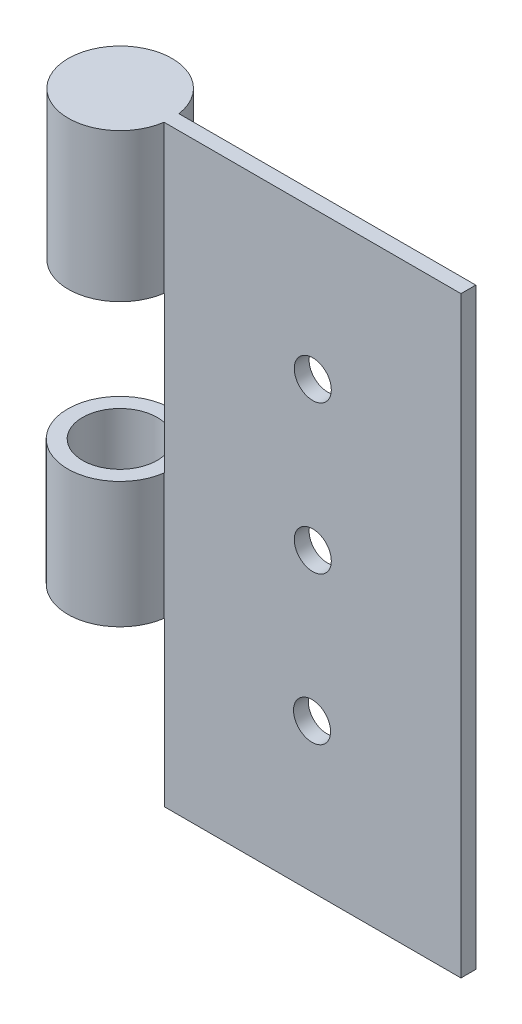
ISO-10303-21;
HEADER;
FILE_DESCRIPTION(('STEP AP214'),'2;1');
FILE_NAME('part.step','',(''),(''),'','','');
FILE_SCHEMA(('AUTOMOTIVE_DESIGN { 1 0 10303 214 1 1 1 1 }'));
ENDSEC;
DATA;
#1=APPLICATION_CONTEXT('core data for automotive mechanical design processes');
#2=APPLICATION_PROTOCOL_DEFINITION('international standard','automotive_design',2000,#1);
#3=PRODUCT_CONTEXT('',#1,'mechanical');
#4=PRODUCT('Part','Part','',(#3));
#5=PRODUCT_RELATED_PRODUCT_CATEGORY('part','',(#4));
#6=PRODUCT_DEFINITION_FORMATION('','',#4);
#7=PRODUCT_DEFINITION_CONTEXT('part definition',#1,'design');
#8=PRODUCT_DEFINITION('design','',#6,#7);
#9=PRODUCT_DEFINITION_SHAPE('','',#8);
#10=(LENGTH_UNIT() NAMED_UNIT(*) SI_UNIT(.MILLI.,.METRE.));
#11=(NAMED_UNIT(*) PLANE_ANGLE_UNIT() SI_UNIT($,.RADIAN.));
#12=(NAMED_UNIT(*) SI_UNIT($,.STERADIAN.) SOLID_ANGLE_UNIT());
#13=UNCERTAINTY_MEASURE_WITH_UNIT(LENGTH_MEASURE(1.E-05),#10,'distance_accuracy_value','');
#14=(GEOMETRIC_REPRESENTATION_CONTEXT(3) GLOBAL_UNCERTAINTY_ASSIGNED_CONTEXT((#13)) GLOBAL_UNIT_ASSIGNED_CONTEXT((#10,
#11,#12)) REPRESENTATION_CONTEXT('',''));
#15=CARTESIAN_POINT('',(0.,0.,0.));
#16=DIRECTION('',(0.,0.,1.));
#17=DIRECTION('',(1.,0.,0.));
#18=AXIS2_PLACEMENT_3D('',#15,#16,#17);
#19=CARTESIAN_POINT('',(-8.89,0.,-1.27));
#20=DIRECTION('',(0.,-1.,0.));
#21=DIRECTION('',(0.,0.,-1.));
#22=AXIS2_PLACEMENT_3D('',#19,#20,#21);
#23=CYLINDRICAL_SURFACE('',#22,6.35);
#24=CARTESIAN_POINT('',(-8.89,76.2,-1.27));
#25=DIRECTION('',(0.,-1.,0.));
#26=DIRECTION('',(0.,0.,-1.));
#27=AXIS2_PLACEMENT_3D('',#24,#25,#26);
#28=CIRCLE('',#27,6.35);
#29=CARTESIAN_POINT('',(-8.89,76.2,-7.62));
#30=VERTEX_POINT('',#29);
#31=EDGE_CURVE('E164',#30,#30,#28,.T.);
#32=ORIENTED_EDGE('',*,*,#31,.T.);
#33=EDGE_LOOP('',(#32));
#34=FACE_BOUND('',#33,.T.);
#35=CARTESIAN_POINT('',(-8.89,99.06,-1.27));
#36=DIRECTION('',(0.,1.,0.));
#37=DIRECTION('',(0.,0.,1.));
#38=AXIS2_PLACEMENT_3D('',#35,#36,#37);
#39=CIRCLE('',#38,6.35);
#40=CARTESIAN_POINT('',(-8.89,99.06,5.08));
#41=VERTEX_POINT('',#40);
#42=EDGE_CURVE('E138',#41,#41,#39,.T.);
#43=ORIENTED_EDGE('',*,*,#42,.T.);
#44=EDGE_LOOP('',(#43));
#45=FACE_BOUND('',#44,.T.);
#46=ADVANCED_FACE('F33',(#34,#45),#23,.F.);
#47=CARTESIAN_POINT('',(0.,0.,-2.54));
#48=DIRECTION('',(-1.,0.,0.));
#49=DIRECTION('',(0.,0.,1.));
#50=AXIS2_PLACEMENT_3D('',#47,#48,#49);
#51=PLANE('',#50);
#52=DIRECTION('',(0.,-1.,0.));
#53=VECTOR('',#52,1.);
#54=CARTESIAN_POINT('',(0.,0.,-2.54));
#55=LINE('',#54,#53);
#56=CARTESIAN_POINT('',(0.,76.2,-2.54));
#57=VERTEX_POINT('',#56);
#58=CARTESIAN_POINT('',(0.,49.53,-2.54));
#59=VERTEX_POINT('',#58);
#60=EDGE_CURVE('E197',#57,#59,#55,.T.);
#61=ORIENTED_EDGE('',*,*,#60,.T.);
#62=DIRECTION('',(0.,0.,-1.));
#63=VECTOR('',#62,1.);
#64=CARTESIAN_POINT('',(0.,49.53,-2.54));
#65=LINE('',#64,#63);
#66=CARTESIAN_POINT('',(0.,49.53,0.));
#67=VERTEX_POINT('',#66);
#68=EDGE_CURVE('E58',#67,#59,#65,.T.);
#69=ORIENTED_EDGE('',*,*,#68,.F.);
#70=DIRECTION('',(0.,-1.,0.));
#71=VECTOR('',#70,1.);
#72=CARTESIAN_POINT('',(0.,0.,0.));
#73=LINE('',#72,#71);
#74=CARTESIAN_POINT('',(0.,76.2,0.));
#75=VERTEX_POINT('',#74);
#76=EDGE_CURVE('E207',#75,#67,#73,.T.);
#77=ORIENTED_EDGE('',*,*,#76,.F.);
#78=DIRECTION('',(0.,0.,1.));
#79=VECTOR('',#78,1.);
#80=CARTESIAN_POINT('',(0.,76.2,0.));
#81=LINE('',#80,#79);
#82=EDGE_CURVE('E176',#57,#75,#81,.T.);
#83=ORIENTED_EDGE('',*,*,#82,.F.);
#84=EDGE_LOOP('',(#61,#69,#77,#83));
#85=FACE_BOUND('',#84,.T.);
#86=ADVANCED_FACE('F35',(#85),#51,.T.);
#87=DIRECTION('',(0.,0.,1.));
#88=VECTOR('',#87,1.);
#89=CARTESIAN_POINT('',(0.,27.94,-2.53999999999999));
#90=LINE('',#89,#88);
#91=CARTESIAN_POINT('',(0.,27.94,-2.54));
#92=VERTEX_POINT('',#91);
#93=CARTESIAN_POINT('',(0.,27.94,0.));
#94=VERTEX_POINT('',#93);
#95=EDGE_CURVE('E50',#92,#94,#90,.T.);
#96=ORIENTED_EDGE('',*,*,#95,.F.);
#97=CARTESIAN_POINT('',(0.,0.,-2.54));
#98=VERTEX_POINT('',#97);
#99=EDGE_CURVE('E135',#92,#98,#55,.T.);
#100=ORIENTED_EDGE('',*,*,#99,.T.);
#101=DIRECTION('',(0.,0.,1.));
#102=VECTOR('',#101,1.);
#103=CARTESIAN_POINT('',(0.,0.,-2.54));
#104=LINE('',#103,#102);
#105=CARTESIAN_POINT('',(0.,0.,0.));
#106=VERTEX_POINT('',#105);
#107=EDGE_CURVE('E37',#98,#106,#104,.T.);
#108=ORIENTED_EDGE('',*,*,#107,.T.);
#109=EDGE_CURVE('E196',#94,#106,#73,.T.);
#110=ORIENTED_EDGE('',*,*,#109,.F.);
#111=EDGE_LOOP('',(#96,#100,#108,#110));
#112=FACE_BOUND('',#111,.T.);
#113=ADVANCED_FACE('F222',(#112),#51,.T.);
#114=CARTESIAN_POINT('',(-8.93559094884371,101.6,-1.27));
#115=DIRECTION('',(0.,1.,0.));
#116=DIRECTION('',(-1.,0.,0.));
#117=AXIS2_PLACEMENT_3D('',#114,#115,#116);
#118=CYLINDRICAL_SURFACE('',#117,8.9355909488437);
#119=CARTESIAN_POINT('',(-8.9355909488437,49.53,-1.27));
#120=DIRECTION('',(0.,1.,0.));
#121=DIRECTION('',(-1.,0.,0.));
#122=AXIS2_PLACEMENT_3D('',#119,#120,#121);
#123=CIRCLE('',#122,8.9355909488437);
#124=CARTESIAN_POINT('',(-0.090711887767882,49.53,-2.54));
#125=VERTEX_POINT('',#124);
#126=CARTESIAN_POINT('',(-0.090711887767882,49.53,0.));
#127=VERTEX_POINT('',#126);
#128=EDGE_CURVE('E123',#125,#127,#123,.T.);
#129=ORIENTED_EDGE('',*,*,#128,.F.);
#130=DIRECTION('',(0.,1.,0.));
#131=VECTOR('',#130,1.);
#132=CARTESIAN_POINT('',(-0.0907118877678907,101.6,-2.54));
#133=LINE('',#132,#131);
#134=CARTESIAN_POINT('',(-0.0907118877678803,27.94,-2.53999999999999));
#135=VERTEX_POINT('',#134);
#136=EDGE_CURVE('E127',#135,#125,#133,.T.);
#137=ORIENTED_EDGE('',*,*,#136,.F.);
#138=CARTESIAN_POINT('',(-8.9355909488437,27.94,-1.27));
#139=DIRECTION('',(0.,1.,0.));
#140=DIRECTION('',(-1.,0.,0.));
#141=AXIS2_PLACEMENT_3D('',#138,#139,#140);
#142=CIRCLE('',#141,8.9355909488437);
#143=CARTESIAN_POINT('',(-0.090711887767882,27.94,0.));
#144=VERTEX_POINT('',#143);
#145=EDGE_CURVE('E112',#135,#144,#142,.T.);
#146=ORIENTED_EDGE('',*,*,#145,.T.);
#147=DIRECTION('',(0.,1.,0.));
#148=VECTOR('',#147,1.);
#149=CARTESIAN_POINT('',(-0.090711887767889,101.6,0.));
#150=LINE('',#149,#148);
#151=EDGE_CURVE('E148',#127,#144,#150,.F.);
#152=ORIENTED_EDGE('',*,*,#151,.F.);
#153=EDGE_LOOP('',(#129,#137,#146,#152));
#154=FACE_BOUND('',#153,.T.);
#155=ADVANCED_FACE('F128',(#154),#118,.T.);
#156=CARTESIAN_POINT('',(-8.89,0.,-1.27));
#157=DIRECTION('',(0.,-1.,0.));
#158=DIRECTION('',(0.,0.,-1.));
#159=AXIS2_PLACEMENT_3D('',#156,#157,#158);
#160=CYLINDRICAL_SURFACE('',#159,8.89);
#161=CARTESIAN_POINT('',(-8.89,101.6,-1.27));
#162=DIRECTION('',(0.,-1.,0.));
#163=DIRECTION('',(0.,0.,-1.));
#164=AXIS2_PLACEMENT_3D('',#161,#162,#163);
#165=CIRCLE('',#164,8.89);
#166=CARTESIAN_POINT('',(-0.0911818976874201,101.6,0.));
#167=VERTEX_POINT('',#166);
#168=CARTESIAN_POINT('',(-0.0911818975501029,101.6,-2.54));
#169=VERTEX_POINT('',#168);
#170=EDGE_CURVE('E167',#167,#169,#165,.T.);
#171=ORIENTED_EDGE('',*,*,#170,.T.);
#172=DIRECTION('',(0.,-1.,0.));
#173=VECTOR('',#172,1.);
#174=CARTESIAN_POINT('',(-0.0911818975501029,0.,-2.53999999999999));
#175=LINE('',#174,#173);
#176=CARTESIAN_POINT('',(-0.0911818975501029,76.2,-2.54));
#177=VERTEX_POINT('',#176);
#178=EDGE_CURVE('E158',#177,#169,#175,.F.);
#179=ORIENTED_EDGE('',*,*,#178,.F.);
#180=CARTESIAN_POINT('',(-8.89,76.2,-1.27));
#181=DIRECTION('',(0.,-1.,0.));
#182=DIRECTION('',(0.,0.,-1.));
#183=AXIS2_PLACEMENT_3D('',#180,#181,#182);
#184=CIRCLE('',#183,8.89);
#185=CARTESIAN_POINT('',(-0.0911818975529062,76.2,1.94154588240014E-11));
#186=VERTEX_POINT('',#185);
#187=EDGE_CURVE('E161',#186,#177,#184,.T.);
#188=ORIENTED_EDGE('',*,*,#187,.F.);
#189=DIRECTION('',(0.,-1.,0.));
#190=VECTOR('',#189,1.);
#191=CARTESIAN_POINT('',(-0.0911818975501046,0.,0.));
#192=LINE('',#191,#190);
#193=EDGE_CURVE('E170',#167,#186,#192,.T.);
#194=ORIENTED_EDGE('',*,*,#193,.F.);
#195=EDGE_LOOP('',(#171,#179,#188,#194));
#196=FACE_BOUND('',#195,.T.);
#197=ADVANCED_FACE('F239',(#196),#160,.T.);
#198=CARTESIAN_POINT('',(0.,101.6,-2.54));
#199=DIRECTION('',(0.,1.,0.));
#200=DIRECTION('',(0.,0.,1.));
#201=AXIS2_PLACEMENT_3D('',#198,#199,#200);
#202=PLANE('',#201);
#203=DIRECTION('',(-1.,0.,0.));
#204=VECTOR('',#203,1.);
#205=CARTESIAN_POINT('',(0.,101.6,0.));
#206=LINE('',#205,#204);
#207=CARTESIAN_POINT('',(50.8,101.6,0.));
#208=VERTEX_POINT('',#207);
#209=EDGE_CURVE('E216',#208,#167,#206,.T.);
#210=ORIENTED_EDGE('',*,*,#209,.F.);
#211=DIRECTION('',(0.,0.,1.));
#212=VECTOR('',#211,1.);
#213=CARTESIAN_POINT('',(50.8,101.6,-2.54));
#214=LINE('',#213,#212);
#215=CARTESIAN_POINT('',(50.8,101.6,-2.54));
#216=VERTEX_POINT('',#215);
#217=EDGE_CURVE('E11',#216,#208,#214,.T.);
#218=ORIENTED_EDGE('',*,*,#217,.F.);
#219=DIRECTION('',(-1.,0.,0.));
#220=VECTOR('',#219,1.);
#221=CARTESIAN_POINT('',(0.,101.6,-2.54));
#222=LINE('',#221,#220);
#223=EDGE_CURVE('E205',#216,#169,#222,.T.);
#224=ORIENTED_EDGE('',*,*,#223,.T.);
#225=ORIENTED_EDGE('',*,*,#170,.F.);
#226=EDGE_LOOP('',(#210,#218,#224,#225));
#227=FACE_BOUND('',#226,.T.);
#228=ADVANCED_FACE('F244',(#227),#202,.T.);
#229=CARTESIAN_POINT('',(50.8,0.,-2.54));
#230=DIRECTION('',(1.,0.,0.));
#231=DIRECTION('',(0.,0.,-1.));
#232=AXIS2_PLACEMENT_3D('',#229,#230,#231);
#233=PLANE('',#232);
#234=DIRECTION('',(0.,1.,0.));
#235=VECTOR('',#234,1.);
#236=CARTESIAN_POINT('',(50.8,0.,0.));
#237=LINE('',#236,#235);
#238=CARTESIAN_POINT('',(50.8,0.,0.));
#239=VERTEX_POINT('',#238);
#240=EDGE_CURVE('E213',#239,#208,#237,.T.);
#241=ORIENTED_EDGE('',*,*,#240,.F.);
#242=DIRECTION('',(0.,0.,1.));
#243=VECTOR('',#242,1.);
#244=CARTESIAN_POINT('',(50.8,0.,-2.54));
#245=LINE('',#244,#243);
#246=CARTESIAN_POINT('',(50.8,0.,-2.54));
#247=VERTEX_POINT('',#246);
#248=EDGE_CURVE('E42',#247,#239,#245,.T.);
#249=ORIENTED_EDGE('',*,*,#248,.F.);
#250=DIRECTION('',(0.,1.,0.));
#251=VECTOR('',#250,1.);
#252=CARTESIAN_POINT('',(50.8,0.,-2.54));
#253=LINE('',#252,#251);
#254=EDGE_CURVE('E202',#247,#216,#253,.T.);
#255=ORIENTED_EDGE('',*,*,#254,.T.);
#256=ORIENTED_EDGE('',*,*,#217,.T.);
#257=EDGE_LOOP('',(#241,#249,#255,#256));
#258=FACE_BOUND('',#257,.T.);
#259=ADVANCED_FACE('F246',(#258),#233,.T.);
#260=CARTESIAN_POINT('',(0.,0.,-2.54));
#261=DIRECTION('',(0.,-1.,0.));
#262=DIRECTION('',(0.,0.,-1.));
#263=AXIS2_PLACEMENT_3D('',#260,#261,#262);
#264=PLANE('',#263);
#265=DIRECTION('',(1.,0.,0.));
#266=VECTOR('',#265,1.);
#267=CARTESIAN_POINT('',(0.,0.,0.));
#268=LINE('',#267,#266);
#269=EDGE_CURVE('E210',#106,#239,#268,.T.);
#270=ORIENTED_EDGE('',*,*,#269,.F.);
#271=ORIENTED_EDGE('',*,*,#107,.F.);
#272=DIRECTION('',(1.,0.,0.));
#273=VECTOR('',#272,1.);
#274=CARTESIAN_POINT('',(0.,0.,-2.54));
#275=LINE('',#274,#273);
#276=EDGE_CURVE('E199',#98,#247,#275,.T.);
#277=ORIENTED_EDGE('',*,*,#276,.T.);
#278=ORIENTED_EDGE('',*,*,#248,.T.);
#279=EDGE_LOOP('',(#270,#271,#277,#278));
#280=FACE_BOUND('',#279,.T.);
#281=ADVANCED_FACE('F223',(#280),#264,.T.);
#282=CARTESIAN_POINT('',(0.,0.,-2.54));
#283=DIRECTION('',(0.,0.,-1.));
#284=DIRECTION('',(-1.,0.,0.));
#285=AXIS2_PLACEMENT_3D('',#282,#283,#284);
#286=PLANE('',#285);
#287=CARTESIAN_POINT('',(25.4,76.2,-2.54));
#288=DIRECTION('',(0.,0.,1.));
#289=DIRECTION('',(1.,0.,0.));
#290=AXIS2_PLACEMENT_3D('',#287,#288,#289);
#291=CIRCLE('',#290,3.175);
#292=CARTESIAN_POINT('',(28.575,76.2,-2.54));
#293=VERTEX_POINT('',#292);
#294=EDGE_CURVE('E181',#293,#293,#291,.T.);
#295=ORIENTED_EDGE('',*,*,#294,.T.);
#296=EDGE_LOOP('',(#295));
#297=FACE_BOUND('',#296,.T.);
#298=CARTESIAN_POINT('',(25.2726809025081,25.4,-2.54));
#299=DIRECTION('',(0.,0.,1.));
#300=DIRECTION('',(1.,0.,0.));
#301=AXIS2_PLACEMENT_3D('',#298,#299,#300);
#302=CIRCLE('',#301,3.175);
#303=CARTESIAN_POINT('',(28.4476809025081,25.4,-2.54));
#304=VERTEX_POINT('',#303);
#305=EDGE_CURVE('E187',#304,#304,#302,.T.);
#306=ORIENTED_EDGE('',*,*,#305,.T.);
#307=EDGE_LOOP('',(#306));
#308=FACE_BOUND('',#307,.T.);
#309=CARTESIAN_POINT('',(25.4,50.8,-2.54));
#310=DIRECTION('',(0.,0.,1.));
#311=DIRECTION('',(1.,0.,0.));
#312=AXIS2_PLACEMENT_3D('',#309,#310,#311);
#313=CIRCLE('',#312,3.175);
#314=CARTESIAN_POINT('',(28.575,50.8,-2.54));
#315=VERTEX_POINT('',#314);
#316=EDGE_CURVE('E193',#315,#315,#313,.T.);
#317=ORIENTED_EDGE('',*,*,#316,.T.);
#318=EDGE_LOOP('',(#317));
#319=FACE_BOUND('',#318,.T.);
#320=ORIENTED_EDGE('',*,*,#60,.F.);
#321=DIRECTION('',(1.,0.,0.));
#322=VECTOR('',#321,1.);
#323=CARTESIAN_POINT('',(-500000.,76.2,-2.54));
#324=LINE('',#323,#322);
#325=EDGE_CURVE('E153',#177,#57,#324,.T.);
#326=ORIENTED_EDGE('',*,*,#325,.F.);
#327=ORIENTED_EDGE('',*,*,#178,.T.);
#328=ORIENTED_EDGE('',*,*,#223,.F.);
#329=ORIENTED_EDGE('',*,*,#254,.F.);
#330=ORIENTED_EDGE('',*,*,#276,.F.);
#331=ORIENTED_EDGE('',*,*,#99,.F.);
#332=DIRECTION('',(1.,0.,0.));
#333=VECTOR('',#332,1.);
#334=CARTESIAN_POINT('',(-500000.,27.94,-2.53999999999999));
#335=LINE('',#334,#333);
#336=EDGE_CURVE('E117',#135,#92,#335,.T.);
#337=ORIENTED_EDGE('',*,*,#336,.F.);
#338=ORIENTED_EDGE('',*,*,#136,.T.);
#339=DIRECTION('',(1.,0.,0.));
#340=VECTOR('',#339,1.);
#341=CARTESIAN_POINT('',(-500000.,49.53,-2.54));
#342=LINE('',#341,#340);
#343=EDGE_CURVE('E136',#125,#59,#342,.T.);
#344=ORIENTED_EDGE('',*,*,#343,.T.);
#345=EDGE_LOOP('',(#320,#326,#327,#328,#329,#330,#331,#337,#338,#344));
#346=FACE_BOUND('',#345,.T.);
#347=ADVANCED_FACE('F133',(#297,#308,#319,#346),#286,.T.);
#348=CARTESIAN_POINT('',(0.,0.,0.));
#349=DIRECTION('',(0.,0.,-1.));
#350=DIRECTION('',(-1.,0.,0.));
#351=AXIS2_PLACEMENT_3D('',#348,#349,#350);
#352=PLANE('',#351);
#353=CARTESIAN_POINT('',(25.4,76.2,0.));
#354=DIRECTION('',(0.,0.,1.));
#355=DIRECTION('',(1.,0.,0.));
#356=AXIS2_PLACEMENT_3D('',#353,#354,#355);
#357=CIRCLE('',#356,3.175);
#358=CARTESIAN_POINT('',(28.575,76.2,0.));
#359=VERTEX_POINT('',#358);
#360=EDGE_CURVE('E178',#359,#359,#357,.T.);
#361=ORIENTED_EDGE('',*,*,#360,.F.);
#362=EDGE_LOOP('',(#361));
#363=FACE_BOUND('',#362,.T.);
#364=CARTESIAN_POINT('',(25.2726809025081,25.4,0.));
#365=DIRECTION('',(0.,0.,1.));
#366=DIRECTION('',(1.,0.,0.));
#367=AXIS2_PLACEMENT_3D('',#364,#365,#366);
#368=CIRCLE('',#367,3.175);
#369=CARTESIAN_POINT('',(28.4476809025081,25.4,0.));
#370=VERTEX_POINT('',#369);
#371=EDGE_CURVE('E184',#370,#370,#368,.T.);
#372=ORIENTED_EDGE('',*,*,#371,.F.);
#373=EDGE_LOOP('',(#372));
#374=FACE_BOUND('',#373,.T.);
#375=CARTESIAN_POINT('',(25.4,50.8,0.));
#376=DIRECTION('',(0.,0.,1.));
#377=DIRECTION('',(1.,0.,0.));
#378=AXIS2_PLACEMENT_3D('',#375,#376,#377);
#379=CIRCLE('',#378,3.175);
#380=CARTESIAN_POINT('',(28.575,50.8,0.));
#381=VERTEX_POINT('',#380);
#382=EDGE_CURVE('E190',#381,#381,#379,.T.);
#383=ORIENTED_EDGE('',*,*,#382,.F.);
#384=EDGE_LOOP('',(#383));
#385=FACE_BOUND('',#384,.T.);
#386=ORIENTED_EDGE('',*,*,#209,.T.);
#387=ORIENTED_EDGE('',*,*,#193,.T.);
#388=DIRECTION('',(1.,0.,0.));
#389=VECTOR('',#388,1.);
#390=CARTESIAN_POINT('',(-500000.,76.2,0.));
#391=LINE('',#390,#389);
#392=EDGE_CURVE('E173',#186,#75,#391,.T.);
#393=ORIENTED_EDGE('',*,*,#392,.T.);
#394=ORIENTED_EDGE('',*,*,#76,.T.);
#395=DIRECTION('',(1.,0.,0.));
#396=VECTOR('',#395,1.);
#397=CARTESIAN_POINT('',(-500000.,49.53,0.));
#398=LINE('',#397,#396);
#399=EDGE_CURVE('E151',#127,#67,#398,.T.);
#400=ORIENTED_EDGE('',*,*,#399,.F.);
#401=ORIENTED_EDGE('',*,*,#151,.T.);
#402=DIRECTION('',(1.,0.,0.));
#403=VECTOR('',#402,1.);
#404=CARTESIAN_POINT('',(-500000.,27.94,0.));
#405=LINE('',#404,#403);
#406=EDGE_CURVE('E119',#144,#94,#405,.T.);
#407=ORIENTED_EDGE('',*,*,#406,.T.);
#408=ORIENTED_EDGE('',*,*,#109,.T.);
#409=ORIENTED_EDGE('',*,*,#269,.T.);
#410=ORIENTED_EDGE('',*,*,#240,.T.);
#411=EDGE_LOOP('',(#386,#387,#393,#394,#400,#401,#407,#408,#409,#410));
#412=FACE_BOUND('',#411,.T.);
#413=ADVANCED_FACE('F225',(#363,#374,#385,#412),#352,.F.);
#414=CARTESIAN_POINT('',(25.4,50.8,0.));
#415=DIRECTION('',(0.,0.,1.));
#416=DIRECTION('',(1.,0.,0.));
#417=AXIS2_PLACEMENT_3D('',#414,#415,#416);
#418=CYLINDRICAL_SURFACE('',#417,3.175);
#419=ORIENTED_EDGE('',*,*,#316,.F.);
#420=EDGE_LOOP('',(#419));
#421=FACE_BOUND('',#420,.T.);
#422=ORIENTED_EDGE('',*,*,#382,.T.);
#423=EDGE_LOOP('',(#422));
#424=FACE_BOUND('',#423,.T.);
#425=ADVANCED_FACE('F275',(#421,#424),#418,.F.);
#426=CARTESIAN_POINT('',(25.2726809025081,25.4,0.));
#427=DIRECTION('',(0.,0.,1.));
#428=DIRECTION('',(1.,0.,0.));
#429=AXIS2_PLACEMENT_3D('',#426,#427,#428);
#430=CYLINDRICAL_SURFACE('',#429,3.175);
#431=ORIENTED_EDGE('',*,*,#305,.F.);
#432=EDGE_LOOP('',(#431));
#433=FACE_BOUND('',#432,.T.);
#434=ORIENTED_EDGE('',*,*,#371,.T.);
#435=EDGE_LOOP('',(#434));
#436=FACE_BOUND('',#435,.T.);
#437=ADVANCED_FACE('F271',(#433,#436),#430,.F.);
#438=CARTESIAN_POINT('',(25.4,76.2,0.));
#439=DIRECTION('',(0.,0.,1.));
#440=DIRECTION('',(1.,0.,0.));
#441=AXIS2_PLACEMENT_3D('',#438,#439,#440);
#442=CYLINDRICAL_SURFACE('',#441,3.175);
#443=ORIENTED_EDGE('',*,*,#294,.F.);
#444=EDGE_LOOP('',(#443));
#445=FACE_BOUND('',#444,.T.);
#446=ORIENTED_EDGE('',*,*,#360,.T.);
#447=EDGE_LOOP('',(#446));
#448=FACE_BOUND('',#447,.T.);
#449=ADVANCED_FACE('F268',(#445,#448),#442,.F.);
#450=CARTESIAN_POINT('',(-500000.,76.2,0.));
#451=DIRECTION('',(0.,1.,0.));
#452=DIRECTION('',(0.,0.,1.));
#453=AXIS2_PLACEMENT_3D('',#450,#451,#452);
#454=PLANE('',#453);
#455=ORIENTED_EDGE('',*,*,#392,.F.);
#456=ORIENTED_EDGE('',*,*,#187,.T.);
#457=ORIENTED_EDGE('',*,*,#325,.T.);
#458=ORIENTED_EDGE('',*,*,#82,.T.);
#459=EDGE_LOOP('',(#455,#456,#457,#458));
#460=FACE_BOUND('',#459,.T.);
#461=ORIENTED_EDGE('',*,*,#31,.F.);
#462=EDGE_LOOP('',(#461));
#463=FACE_BOUND('',#462,.T.);
#464=ADVANCED_FACE('F234',(#460,#463),#454,.F.);
#465=CARTESIAN_POINT('',(-500000.,49.53,-2.54));
#466=DIRECTION('',(0.,-1.,0.));
#467=DIRECTION('',(0.,0.,-1.));
#468=AXIS2_PLACEMENT_3D('',#465,#466,#467);
#469=PLANE('',#468);
#470=ORIENTED_EDGE('',*,*,#68,.T.);
#471=ORIENTED_EDGE('',*,*,#343,.F.);
#472=ORIENTED_EDGE('',*,*,#128,.T.);
#473=ORIENTED_EDGE('',*,*,#399,.T.);
#474=EDGE_LOOP('',(#470,#471,#472,#473));
#475=FACE_BOUND('',#474,.T.);
#476=CARTESIAN_POINT('',(-8.9355909488437,49.53,-1.27));
#477=DIRECTION('',(0.,1.,0.));
#478=DIRECTION('',(-1.,0.,0.));
#479=AXIS2_PLACEMENT_3D('',#476,#477,#478);
#480=CIRCLE('',#479,6.3955909488437);
#481=CARTESIAN_POINT('',(-15.3311818976874,49.53,-1.27));
#482=VERTEX_POINT('',#481);
#483=EDGE_CURVE('E145',#482,#482,#480,.T.);
#484=ORIENTED_EDGE('',*,*,#483,.F.);
#485=EDGE_LOOP('',(#484));
#486=FACE_BOUND('',#485,.T.);
#487=ADVANCED_FACE('F229',(#475,#486),#469,.F.);
#488=CARTESIAN_POINT('',(-500000.,27.94,-2.53999999999999));
#489=DIRECTION('',(0.,1.,0.));
#490=DIRECTION('',(0.,0.,1.));
#491=AXIS2_PLACEMENT_3D('',#488,#489,#490);
#492=PLANE('',#491);
#493=ORIENTED_EDGE('',*,*,#406,.F.);
#494=ORIENTED_EDGE('',*,*,#145,.F.);
#495=ORIENTED_EDGE('',*,*,#336,.T.);
#496=ORIENTED_EDGE('',*,*,#95,.T.);
#497=EDGE_LOOP('',(#493,#494,#495,#496));
#498=FACE_BOUND('',#497,.T.);
#499=CARTESIAN_POINT('',(-8.9355909488437,27.94,-1.27));
#500=DIRECTION('',(0.,1.,0.));
#501=DIRECTION('',(-1.,0.,0.));
#502=AXIS2_PLACEMENT_3D('',#499,#500,#501);
#503=CIRCLE('',#502,6.3955909488437);
#504=CARTESIAN_POINT('',(-15.3311818976874,27.94,-1.27));
#505=VERTEX_POINT('',#504);
#506=EDGE_CURVE('E124',#505,#505,#503,.T.);
#507=ORIENTED_EDGE('',*,*,#506,.T.);
#508=EDGE_LOOP('',(#507));
#509=FACE_BOUND('',#508,.T.);
#510=ADVANCED_FACE('F114',(#498,#509),#492,.F.);
#511=CARTESIAN_POINT('',(-8.93559094884371,101.6,-1.27));
#512=DIRECTION('',(0.,1.,0.));
#513=DIRECTION('',(-1.,0.,0.));
#514=AXIS2_PLACEMENT_3D('',#511,#512,#513);
#515=CYLINDRICAL_SURFACE('',#514,6.3955909488437);
#516=ORIENTED_EDGE('',*,*,#483,.T.);
#517=EDGE_LOOP('',(#516));
#518=FACE_BOUND('',#517,.T.);
#519=ORIENTED_EDGE('',*,*,#506,.F.);
#520=EDGE_LOOP('',(#519));
#521=FACE_BOUND('',#520,.T.);
#522=ADVANCED_FACE('F322',(#518,#521),#515,.F.);
#523=CARTESIAN_POINT('',(-8.89,99.06,-1.27));
#524=DIRECTION('',(0.,1.,0.));
#525=DIRECTION('',(0.,0.,1.));
#526=AXIS2_PLACEMENT_3D('',#523,#524,#525);
#527=PLANE('',#526);
#528=ORIENTED_EDGE('',*,*,#42,.F.);
#529=EDGE_LOOP('',(#528));
#530=FACE_BOUND('',#529,.T.);
#531=ADVANCED_FACE('F333',(#530),#527,.F.);
#532=CLOSED_SHELL('',(#46,#86,#113,#155,#197,#228,#259,#281,#347,#413,#425,#437,#449,#464,#487,
#510,#522,#531));
#533=MANIFOLD_SOLID_BREP('B2',#532);
#534=ADVANCED_BREP_SHAPE_REPRESENTATION('',(#18,#533),#14);
#535=SHAPE_DEFINITION_REPRESENTATION(#9,#534);
ENDSEC;
END-ISO-10303-21;
